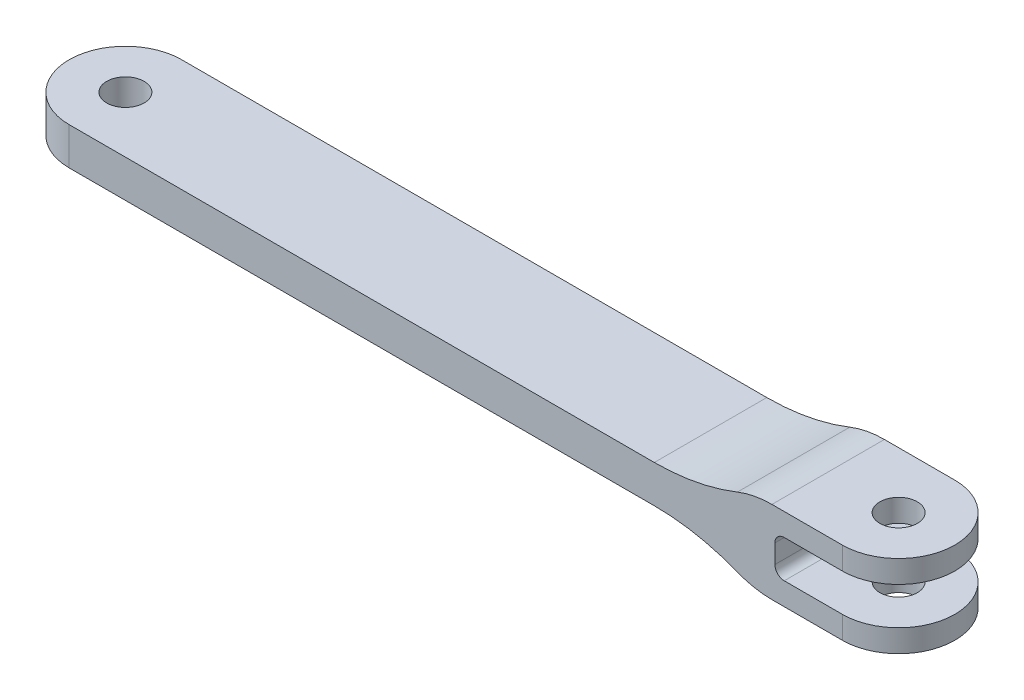
ISO-10303-21;
HEADER;
FILE_DESCRIPTION(('STEP AP214'),'2;1');
FILE_NAME('part.step','',(''),(''),'','','');
FILE_SCHEMA(('AUTOMOTIVE_DESIGN { 1 0 10303 214 1 1 1 1 }'));
ENDSEC;
DATA;
#1=APPLICATION_CONTEXT('core data for automotive mechanical design processes');
#2=APPLICATION_PROTOCOL_DEFINITION('international standard','automotive_design',2000,#1);
#3=PRODUCT_CONTEXT('',#1,'mechanical');
#4=PRODUCT('Part','Part','',(#3));
#5=PRODUCT_RELATED_PRODUCT_CATEGORY('part','',(#4));
#6=PRODUCT_DEFINITION_FORMATION('','',#4);
#7=PRODUCT_DEFINITION_CONTEXT('part definition',#1,'design');
#8=PRODUCT_DEFINITION('design','',#6,#7);
#9=PRODUCT_DEFINITION_SHAPE('','',#8);
#10=(LENGTH_UNIT() NAMED_UNIT(*) SI_UNIT(.MILLI.,.METRE.));
#11=(NAMED_UNIT(*) PLANE_ANGLE_UNIT() SI_UNIT($,.RADIAN.));
#12=(NAMED_UNIT(*) SI_UNIT($,.STERADIAN.) SOLID_ANGLE_UNIT());
#13=UNCERTAINTY_MEASURE_WITH_UNIT(LENGTH_MEASURE(1.E-05),#10,'distance_accuracy_value','');
#14=(GEOMETRIC_REPRESENTATION_CONTEXT(3) GLOBAL_UNCERTAINTY_ASSIGNED_CONTEXT((#13)) GLOBAL_UNIT_ASSIGNED_CONTEXT((#10,
#11,#12)) REPRESENTATION_CONTEXT('',''));
#15=CARTESIAN_POINT('',(0.,0.,0.));
#16=DIRECTION('',(0.,0.,1.));
#17=DIRECTION('',(1.,0.,0.));
#18=AXIS2_PLACEMENT_3D('',#15,#16,#17);
#19=CARTESIAN_POINT('',(42.0046244107277,4.5,0.));
#20=DIRECTION('',(0.,-1.,0.));
#21=DIRECTION('',(0.,0.,-1.));
#22=AXIS2_PLACEMENT_3D('',#19,#20,#21);
#23=CYLINDRICAL_SURFACE('',#22,6.);
#24=CARTESIAN_POINT('',(42.0046244107277,0.5,0.));
#25=DIRECTION('',(0.,1.,0.));
#26=DIRECTION('',(0.,0.,1.));
#27=AXIS2_PLACEMENT_3D('',#24,#25,#26);
#28=CIRCLE('',#27,6.);
#29=CARTESIAN_POINT('',(42.0046244107277,0.5,5.99999999999998));
#30=VERTEX_POINT('',#29);
#31=CARTESIAN_POINT('',(42.0046244107277,0.5,-6.00000000000002));
#32=VERTEX_POINT('',#31);
#33=EDGE_CURVE('E162',#30,#32,#28,.T.);
#34=ORIENTED_EDGE('',*,*,#33,.F.);
#35=DIRECTION('',(0.,-1.,0.));
#36=VECTOR('',#35,1.);
#37=CARTESIAN_POINT('',(42.0046244107277,4.5,5.99999999999998));
#38=LINE('',#37,#36);
#39=CARTESIAN_POINT('',(42.0046244107277,-1.9,5.99999999999998));
#40=VERTEX_POINT('',#39);
#41=EDGE_CURVE('E174',#30,#40,#38,.T.);
#42=ORIENTED_EDGE('',*,*,#41,.T.);
#43=CARTESIAN_POINT('',(42.0046244107277,-1.9,0.));
#44=DIRECTION('',(0.,1.,0.));
#45=DIRECTION('',(0.,0.,1.));
#46=AXIS2_PLACEMENT_3D('',#43,#44,#45);
#47=CIRCLE('',#46,6.);
#48=CARTESIAN_POINT('',(42.0046244107277,-1.9,-6.00000000000002));
#49=VERTEX_POINT('',#48);
#50=EDGE_CURVE('E254',#40,#49,#47,.T.);
#51=ORIENTED_EDGE('',*,*,#50,.T.);
#52=DIRECTION('',(0.,-1.,0.));
#53=VECTOR('',#52,1.);
#54=CARTESIAN_POINT('',(42.0046244107277,4.5,-6.00000000000002));
#55=LINE('',#54,#53);
#56=EDGE_CURVE('E176',#32,#49,#55,.T.);
#57=ORIENTED_EDGE('',*,*,#56,.F.);
#58=EDGE_LOOP('',(#34,#42,#51,#57));
#59=FACE_BOUND('',#58,.T.);
#60=ADVANCED_FACE('F44',(#59),#23,.T.);
#61=CARTESIAN_POINT('',(-40.4859221492723,4.5,0.));
#62=DIRECTION('',(0.,1.,0.));
#63=DIRECTION('',(0.,0.,1.));
#64=AXIS2_PLACEMENT_3D('',#61,#62,#63);
#65=PLANE('',#64);
#66=CARTESIAN_POINT('',(-40.4859221492723,4.5,0.));
#67=DIRECTION('',(0.,1.,0.));
#68=DIRECTION('',(0.,0.,1.));
#69=AXIS2_PLACEMENT_3D('',#66,#67,#68);
#70=CIRCLE('',#69,2.);
#71=CARTESIAN_POINT('',(-40.4859221492723,4.5,2.));
#72=VERTEX_POINT('',#71);
#73=EDGE_CURVE('E215',#72,#72,#70,.T.);
#74=ORIENTED_EDGE('',*,*,#73,.F.);
#75=EDGE_LOOP('',(#74));
#76=FACE_BOUND('',#75,.T.);
#77=DIRECTION('',(1.,0.,0.));
#78=VECTOR('',#77,1.);
#79=CARTESIAN_POINT('',(-40.4859221492723,4.5,6.));
#80=LINE('',#79,#78);
#81=CARTESIAN_POINT('',(-40.4859221492723,4.5,6.));
#82=VERTEX_POINT('',#81);
#83=CARTESIAN_POINT('',(21.9432669462301,4.5,5.99999999999999));
#84=VERTEX_POINT('',#83);
#85=EDGE_CURVE('E269',#82,#84,#80,.T.);
#86=ORIENTED_EDGE('',*,*,#85,.T.);
#87=DIRECTION('',(0.,0.,1.));
#88=VECTOR('',#87,1.);
#89=CARTESIAN_POINT('',(21.9432669462301,4.5,-6.00000000000001));
#90=LINE('',#89,#88);
#91=CARTESIAN_POINT('',(21.9432669462301,4.5,-6.00000000000001));
#92=VERTEX_POINT('',#91);
#93=EDGE_CURVE('E197',#84,#92,#90,.F.);
#94=ORIENTED_EDGE('',*,*,#93,.T.);
#95=DIRECTION('',(-1.,0.,0.));
#96=VECTOR('',#95,1.);
#97=CARTESIAN_POINT('',(-40.4859221492723,4.5,-6.));
#98=LINE('',#97,#96);
#99=CARTESIAN_POINT('',(-40.4859221492723,4.5,-6.));
#100=VERTEX_POINT('',#99);
#101=EDGE_CURVE('E273',#92,#100,#98,.T.);
#102=ORIENTED_EDGE('',*,*,#101,.T.);
#103=CARTESIAN_POINT('',(-40.4859221492723,4.5,0.));
#104=DIRECTION('',(0.,1.,0.));
#105=DIRECTION('',(0.,0.,1.));
#106=AXIS2_PLACEMENT_3D('',#103,#104,#105);
#107=CIRCLE('',#106,6.);
#108=EDGE_CURVE('E266',#100,#82,#107,.T.);
#109=ORIENTED_EDGE('',*,*,#108,.T.);
#110=EDGE_LOOP('',(#86,#94,#102,#109));
#111=FACE_BOUND('',#110,.T.);
#112=ADVANCED_FACE('F313',(#76,#111),#65,.T.);
#113=CARTESIAN_POINT('',(-40.4859221492723,0.5,0.));
#114=DIRECTION('',(0.,1.,0.));
#115=DIRECTION('',(0.,0.,1.));
#116=AXIS2_PLACEMENT_3D('',#113,#114,#115);
#117=PLANE('',#116);
#118=CARTESIAN_POINT('',(-40.4859221492723,0.5,0.));
#119=DIRECTION('',(0.,1.,0.));
#120=DIRECTION('',(0.,0.,1.));
#121=AXIS2_PLACEMENT_3D('',#118,#119,#120);
#122=CIRCLE('',#121,2.);
#123=CARTESIAN_POINT('',(-40.4859221492723,0.5,2.));
#124=VERTEX_POINT('',#123);
#125=EDGE_CURVE('E212',#124,#124,#122,.T.);
#126=ORIENTED_EDGE('',*,*,#125,.T.);
#127=EDGE_LOOP('',(#126));
#128=FACE_BOUND('',#127,.T.);
#129=DIRECTION('',(-1.,0.,0.));
#130=VECTOR('',#129,1.);
#131=CARTESIAN_POINT('',(-40.4859221492723,0.5,-6.));
#132=LINE('',#131,#130);
#133=CARTESIAN_POINT('',(21.9432669462301,0.5,-6.00000000000001));
#134=VERTEX_POINT('',#133);
#135=CARTESIAN_POINT('',(-40.4859221492723,0.5,-6.));
#136=VERTEX_POINT('',#135);
#137=EDGE_CURVE('E270',#134,#136,#132,.T.);
#138=ORIENTED_EDGE('',*,*,#137,.F.);
#139=DIRECTION('',(0.,0.,-1.));
#140=VECTOR('',#139,1.);
#141=CARTESIAN_POINT('',(21.9432669462301,0.5,0.));
#142=LINE('',#141,#140);
#143=CARTESIAN_POINT('',(21.9432669462301,0.5,5.99999999999999));
#144=VERTEX_POINT('',#143);
#145=EDGE_CURVE('E194',#134,#144,#142,.F.);
#146=ORIENTED_EDGE('',*,*,#145,.T.);
#147=DIRECTION('',(1.,0.,0.));
#148=VECTOR('',#147,1.);
#149=CARTESIAN_POINT('',(-40.4859221492723,0.5,6.));
#150=LINE('',#149,#148);
#151=CARTESIAN_POINT('',(-40.4859221492723,0.5,6.));
#152=VERTEX_POINT('',#151);
#153=EDGE_CURVE('E278',#152,#144,#150,.T.);
#154=ORIENTED_EDGE('',*,*,#153,.F.);
#155=CARTESIAN_POINT('',(-40.4859221492723,0.5,0.));
#156=DIRECTION('',(0.,1.,0.));
#157=DIRECTION('',(0.,0.,1.));
#158=AXIS2_PLACEMENT_3D('',#155,#156,#157);
#159=CIRCLE('',#158,6.);
#160=EDGE_CURVE('E265',#136,#152,#159,.T.);
#161=ORIENTED_EDGE('',*,*,#160,.F.);
#162=EDGE_LOOP('',(#138,#146,#154,#161));
#163=FACE_BOUND('',#162,.T.);
#164=ADVANCED_FACE('F301',(#128,#163),#117,.F.);
#165=CARTESIAN_POINT('',(-40.4859221492723,4.5,0.));
#166=DIRECTION('',(0.,-1.,0.));
#167=DIRECTION('',(0.,0.,-1.));
#168=AXIS2_PLACEMENT_3D('',#165,#166,#167);
#169=CYLINDRICAL_SURFACE('',#168,6.);
#170=ORIENTED_EDGE('',*,*,#160,.T.);
#171=DIRECTION('',(0.,-1.,0.));
#172=VECTOR('',#171,1.);
#173=CARTESIAN_POINT('',(-40.4859221492723,4.5,6.));
#174=LINE('',#173,#172);
#175=EDGE_CURVE('E187',#82,#152,#174,.T.);
#176=ORIENTED_EDGE('',*,*,#175,.F.);
#177=ORIENTED_EDGE('',*,*,#108,.F.);
#178=DIRECTION('',(0.,-1.,0.));
#179=VECTOR('',#178,1.);
#180=CARTESIAN_POINT('',(-40.4859221492723,4.5,-6.));
#181=LINE('',#180,#179);
#182=EDGE_CURVE('E275',#100,#136,#181,.T.);
#183=ORIENTED_EDGE('',*,*,#182,.T.);
#184=EDGE_LOOP('',(#170,#176,#177,#183));
#185=FACE_BOUND('',#184,.T.);
#186=ADVANCED_FACE('F303',(#185),#169,.T.);
#187=CARTESIAN_POINT('',(-40.4859221492723,4.5,6.));
#188=DIRECTION('',(0.,0.,-1.));
#189=DIRECTION('',(-1.,0.,0.));
#190=AXIS2_PLACEMENT_3D('',#187,#188,#189);
#191=PLANE('',#190);
#192=CARTESIAN_POINT('',(21.9432669462301,-23.5,5.99999999999999));
#193=DIRECTION('',(0.,0.,-1.));
#194=DIRECTION('',(-1.,0.,0.));
#195=AXIS2_PLACEMENT_3D('',#192,#193,#194);
#196=CIRCLE('',#195,24.);
#197=CARTESIAN_POINT('',(30.8003326260559,-1.19411764705882,5.99999999999999));
#198=VERTEX_POINT('',#197);
#199=EDGE_CURVE('E199',#144,#198,#196,.T.);
#200=ORIENTED_EDGE('',*,*,#199,.T.);
#201=CARTESIAN_POINT('',(34.4907766593166,8.1,5.99999999999998));
#202=DIRECTION('',(0.,0.,-1.));
#203=DIRECTION('',(-1.,0.,0.));
#204=AXIS2_PLACEMENT_3D('',#201,#202,#203);
#205=CIRCLE('',#204,10.);
#206=CARTESIAN_POINT('',(34.4907766593166,-1.9,6.));
#207=VERTEX_POINT('',#206);
#208=EDGE_CURVE('E237',#198,#207,#205,.F.);
#209=ORIENTED_EDGE('',*,*,#208,.T.);
#210=DIRECTION('',(1.,0.,0.));
#211=VECTOR('',#210,1.);
#212=CARTESIAN_POINT('',(42.0046244107277,-1.9,5.99999999999998));
#213=LINE('',#212,#211);
#214=EDGE_CURVE('E182',#207,#40,#213,.T.);
#215=ORIENTED_EDGE('',*,*,#214,.T.);
#216=ORIENTED_EDGE('',*,*,#41,.F.);
#217=DIRECTION('',(1.,0.,0.));
#218=VECTOR('',#217,1.);
#219=CARTESIAN_POINT('',(34.8046244107277,0.5,6.));
#220=LINE('',#219,#218);
#221=CARTESIAN_POINT('',(35.8046244107277,0.5,6.));
#222=VERTEX_POINT('',#221);
#223=EDGE_CURVE('E158',#222,#30,#220,.T.);
#224=ORIENTED_EDGE('',*,*,#223,.F.);
#225=CARTESIAN_POINT('',(35.8046244107277,1.5,5.99999999999998));
#226=DIRECTION('',(0.,0.,-1.));
#227=DIRECTION('',(-1.,0.,0.));
#228=AXIS2_PLACEMENT_3D('',#225,#226,#227);
#229=CIRCLE('',#228,1.);
#230=CARTESIAN_POINT('',(34.8046244107277,1.5,6.));
#231=VERTEX_POINT('',#230);
#232=EDGE_CURVE('E224',#222,#231,#229,.T.);
#233=ORIENTED_EDGE('',*,*,#232,.T.);
#234=DIRECTION('',(0.,-1.,0.));
#235=VECTOR('',#234,1.);
#236=CARTESIAN_POINT('',(34.8046244107277,4.5,6.));
#237=LINE('',#236,#235);
#238=CARTESIAN_POINT('',(34.8046244107277,3.5,6.));
#239=VERTEX_POINT('',#238);
#240=EDGE_CURVE('E336',#239,#231,#237,.T.);
#241=ORIENTED_EDGE('',*,*,#240,.F.);
#242=CARTESIAN_POINT('',(35.8046244107277,3.5,5.99999999999998));
#243=DIRECTION('',(0.,0.,-1.));
#244=DIRECTION('',(-1.,0.,0.));
#245=AXIS2_PLACEMENT_3D('',#242,#243,#244);
#246=CIRCLE('',#245,1.);
#247=CARTESIAN_POINT('',(35.8046244107277,4.5,6.));
#248=VERTEX_POINT('',#247);
#249=EDGE_CURVE('E228',#239,#248,#246,.T.);
#250=ORIENTED_EDGE('',*,*,#249,.T.);
#251=DIRECTION('',(1.,0.,0.));
#252=VECTOR('',#251,1.);
#253=CARTESIAN_POINT('',(34.8046244107277,4.5,6.));
#254=LINE('',#253,#252);
#255=CARTESIAN_POINT('',(42.0046244107277,4.5,5.99999999999998));
#256=VERTEX_POINT('',#255);
#257=EDGE_CURVE('E342',#248,#256,#254,.T.);
#258=ORIENTED_EDGE('',*,*,#257,.T.);
#259=CARTESIAN_POINT('',(42.0046244107277,6.9,5.99999999999998));
#260=VERTEX_POINT('',#259);
#261=EDGE_CURVE('E183',#260,#256,#38,.T.);
#262=ORIENTED_EDGE('',*,*,#261,.F.);
#263=DIRECTION('',(1.,0.,0.));
#264=VECTOR('',#263,1.);
#265=CARTESIAN_POINT('',(42.0046244107277,6.9,5.99999999999998));
#266=LINE('',#265,#264);
#267=CARTESIAN_POINT('',(34.4907766593166,6.9,6.));
#268=VERTEX_POINT('',#267);
#269=EDGE_CURVE('E249',#268,#260,#266,.T.);
#270=ORIENTED_EDGE('',*,*,#269,.F.);
#271=CARTESIAN_POINT('',(34.4907766593166,-3.1,5.99999999999998));
#272=DIRECTION('',(0.,0.,-1.));
#273=DIRECTION('',(-1.,0.,0.));
#274=AXIS2_PLACEMENT_3D('',#271,#272,#273);
#275=CIRCLE('',#274,10.);
#276=CARTESIAN_POINT('',(30.8003326260559,6.19411764705883,5.99999999999999));
#277=VERTEX_POINT('',#276);
#278=EDGE_CURVE('E235',#268,#277,#275,.F.);
#279=ORIENTED_EDGE('',*,*,#278,.T.);
#280=CARTESIAN_POINT('',(21.9432669462301,28.5,5.99999999999999));
#281=DIRECTION('',(0.,0.,-1.));
#282=DIRECTION('',(-1.,0.,0.));
#283=AXIS2_PLACEMENT_3D('',#280,#281,#282);
#284=CIRCLE('',#283,24.);
#285=EDGE_CURVE('E203',#277,#84,#284,.T.);
#286=ORIENTED_EDGE('',*,*,#285,.T.);
#287=ORIENTED_EDGE('',*,*,#85,.F.);
#288=ORIENTED_EDGE('',*,*,#175,.T.);
#289=ORIENTED_EDGE('',*,*,#153,.T.);
#290=EDGE_LOOP('',(#200,#209,#215,#216,#224,#233,#241,#250,#258,#262,#270,#279,#286,#287,#288,#289));
#291=FACE_BOUND('',#290,.T.);
#292=ADVANCED_FACE('F180',(#291),#191,.F.);
#293=ORIENTED_EDGE('',*,*,#261,.T.);
#294=CARTESIAN_POINT('',(42.0046244107277,4.5,0.));
#295=DIRECTION('',(0.,1.,0.));
#296=DIRECTION('',(0.,0.,1.));
#297=AXIS2_PLACEMENT_3D('',#294,#295,#296);
#298=CIRCLE('',#297,6.);
#299=CARTESIAN_POINT('',(42.0046244107277,4.5,-6.00000000000002));
#300=VERTEX_POINT('',#299);
#301=EDGE_CURVE('E333',#256,#300,#298,.T.);
#302=ORIENTED_EDGE('',*,*,#301,.T.);
#303=CARTESIAN_POINT('',(42.0046244107277,6.9,-6.00000000000002));
#304=VERTEX_POINT('',#303);
#305=EDGE_CURVE('E184',#304,#300,#55,.T.);
#306=ORIENTED_EDGE('',*,*,#305,.F.);
#307=CARTESIAN_POINT('',(42.0046244107277,6.9,0.));
#308=DIRECTION('',(0.,1.,0.));
#309=DIRECTION('',(0.,0.,1.));
#310=AXIS2_PLACEMENT_3D('',#307,#308,#309);
#311=CIRCLE('',#310,6.);
#312=EDGE_CURVE('E258',#260,#304,#311,.T.);
#313=ORIENTED_EDGE('',*,*,#312,.F.);
#314=EDGE_LOOP('',(#293,#302,#306,#313));
#315=FACE_BOUND('',#314,.T.);
#316=ADVANCED_FACE('F311',(#315),#23,.T.);
#317=CARTESIAN_POINT('',(-40.4859221492723,4.5,-6.));
#318=DIRECTION('',(0.,0.,1.));
#319=DIRECTION('',(1.,0.,0.));
#320=AXIS2_PLACEMENT_3D('',#317,#318,#319);
#321=PLANE('',#320);
#322=DIRECTION('',(-1.,0.,0.));
#323=VECTOR('',#322,1.);
#324=CARTESIAN_POINT('',(42.0046244107277,-1.9,-6.00000000000002));
#325=LINE('',#324,#323);
#326=CARTESIAN_POINT('',(34.4907766593166,-1.9,-6.00000000000002));
#327=VERTEX_POINT('',#326);
#328=EDGE_CURVE('E256',#49,#327,#325,.T.);
#329=ORIENTED_EDGE('',*,*,#328,.T.);
#330=CARTESIAN_POINT('',(34.4907766593166,8.1,-6.00000000000002));
#331=DIRECTION('',(0.,0.,1.));
#332=DIRECTION('',(1.,0.,0.));
#333=AXIS2_PLACEMENT_3D('',#330,#331,#332);
#334=CIRCLE('',#333,10.);
#335=CARTESIAN_POINT('',(30.8003326260559,-1.19411764705882,-6.00000000000001));
#336=VERTEX_POINT('',#335);
#337=EDGE_CURVE('E242',#327,#336,#334,.F.);
#338=ORIENTED_EDGE('',*,*,#337,.T.);
#339=CARTESIAN_POINT('',(21.9432669462301,-23.5,-6.00000000000001));
#340=DIRECTION('',(0.,0.,1.));
#341=DIRECTION('',(1.,0.,0.));
#342=AXIS2_PLACEMENT_3D('',#339,#340,#341);
#343=CIRCLE('',#342,24.);
#344=EDGE_CURVE('E201',#336,#134,#343,.T.);
#345=ORIENTED_EDGE('',*,*,#344,.T.);
#346=ORIENTED_EDGE('',*,*,#137,.T.);
#347=ORIENTED_EDGE('',*,*,#182,.F.);
#348=ORIENTED_EDGE('',*,*,#101,.F.);
#349=CARTESIAN_POINT('',(21.9432669462301,28.5,-6.00000000000001));
#350=DIRECTION('',(0.,0.,1.));
#351=DIRECTION('',(1.,0.,0.));
#352=AXIS2_PLACEMENT_3D('',#349,#350,#351);
#353=CIRCLE('',#352,24.);
#354=CARTESIAN_POINT('',(30.8003326260559,6.19411764705883,-6.00000000000001));
#355=VERTEX_POINT('',#354);
#356=EDGE_CURVE('E205',#92,#355,#353,.T.);
#357=ORIENTED_EDGE('',*,*,#356,.T.);
#358=CARTESIAN_POINT('',(34.4907766593166,-3.1,-6.00000000000002));
#359=DIRECTION('',(0.,0.,1.));
#360=DIRECTION('',(1.,0.,0.));
#361=AXIS2_PLACEMENT_3D('',#358,#359,#360);
#362=CIRCLE('',#361,10.);
#363=CARTESIAN_POINT('',(34.4907766593166,6.9,-6.00000000000002));
#364=VERTEX_POINT('',#363);
#365=EDGE_CURVE('E59',#355,#364,#362,.F.);
#366=ORIENTED_EDGE('',*,*,#365,.T.);
#367=DIRECTION('',(-1.,0.,0.));
#368=VECTOR('',#367,1.);
#369=CARTESIAN_POINT('',(42.0046244107277,6.9,-6.00000000000002));
#370=LINE('',#369,#368);
#371=EDGE_CURVE('E251',#304,#364,#370,.T.);
#372=ORIENTED_EDGE('',*,*,#371,.F.);
#373=ORIENTED_EDGE('',*,*,#305,.T.);
#374=DIRECTION('',(-1.,0.,0.));
#375=VECTOR('',#374,1.);
#376=CARTESIAN_POINT('',(42.0046244107277,4.5,-6.00000000000002));
#377=LINE('',#376,#375);
#378=CARTESIAN_POINT('',(35.8046244107277,4.5,-6.00000000000002));
#379=VERTEX_POINT('',#378);
#380=EDGE_CURVE('E177',#300,#379,#377,.T.);
#381=ORIENTED_EDGE('',*,*,#380,.T.);
#382=CARTESIAN_POINT('',(35.8046244107277,3.5,-6.00000000000002));
#383=DIRECTION('',(0.,0.,1.));
#384=DIRECTION('',(1.,0.,0.));
#385=AXIS2_PLACEMENT_3D('',#382,#383,#384);
#386=CIRCLE('',#385,1.);
#387=CARTESIAN_POINT('',(34.8046244107277,3.5,-6.00000000000002));
#388=VERTEX_POINT('',#387);
#389=EDGE_CURVE('E230',#379,#388,#386,.T.);
#390=ORIENTED_EDGE('',*,*,#389,.T.);
#391=DIRECTION('',(0.,-1.,0.));
#392=VECTOR('',#391,1.);
#393=CARTESIAN_POINT('',(34.8046244107277,4.5,-6.00000000000002));
#394=LINE('',#393,#392);
#395=CARTESIAN_POINT('',(34.8046244107277,1.5,-6.00000000000002));
#396=VERTEX_POINT('',#395);
#397=EDGE_CURVE('E334',#388,#396,#394,.T.);
#398=ORIENTED_EDGE('',*,*,#397,.T.);
#399=CARTESIAN_POINT('',(35.8046244107277,1.5,-6.00000000000002));
#400=DIRECTION('',(0.,0.,1.));
#401=DIRECTION('',(1.,0.,0.));
#402=AXIS2_PLACEMENT_3D('',#399,#400,#401);
#403=CIRCLE('',#402,1.);
#404=CARTESIAN_POINT('',(35.8046244107277,0.5,-6.00000000000002));
#405=VERTEX_POINT('',#404);
#406=EDGE_CURVE('E226',#396,#405,#403,.T.);
#407=ORIENTED_EDGE('',*,*,#406,.T.);
#408=DIRECTION('',(-1.,0.,0.));
#409=VECTOR('',#408,1.);
#410=CARTESIAN_POINT('',(42.0046244107277,0.5,-6.00000000000002));
#411=LINE('',#410,#409);
#412=EDGE_CURVE('E168',#32,#405,#411,.T.);
#413=ORIENTED_EDGE('',*,*,#412,.F.);
#414=ORIENTED_EDGE('',*,*,#56,.T.);
#415=EDGE_LOOP('',(#329,#338,#345,#346,#347,#348,#357,#366,#372,#373,#381,#390,#398,#407,#413,#414));
#416=FACE_BOUND('',#415,.T.);
#417=ADVANCED_FACE('F287',(#416),#321,.F.);
#418=CARTESIAN_POINT('',(42.0046244107277,-1.9,0.));
#419=DIRECTION('',(0.,1.,0.));
#420=DIRECTION('',(0.,0.,1.));
#421=AXIS2_PLACEMENT_3D('',#418,#419,#420);
#422=PLANE('',#421);
#423=CARTESIAN_POINT('',(42.0046244107277,-1.9,0.));
#424=DIRECTION('',(0.,1.,0.));
#425=DIRECTION('',(0.,0.,1.));
#426=AXIS2_PLACEMENT_3D('',#423,#424,#425);
#427=CIRCLE('',#426,2.);
#428=CARTESIAN_POINT('',(42.0046244107277,-1.9,1.99999999999999));
#429=VERTEX_POINT('',#428);
#430=EDGE_CURVE('E353',#429,#429,#427,.T.);
#431=ORIENTED_EDGE('',*,*,#430,.T.);
#432=EDGE_LOOP('',(#431));
#433=FACE_BOUND('',#432,.T.);
#434=ORIENTED_EDGE('',*,*,#214,.F.);
#435=DIRECTION('',(0.,0.,-1.));
#436=VECTOR('',#435,1.);
#437=CARTESIAN_POINT('',(34.4907766593166,-1.9,0.));
#438=LINE('',#437,#436);
#439=EDGE_CURVE('E239',#207,#327,#438,.T.);
#440=ORIENTED_EDGE('',*,*,#439,.T.);
#441=ORIENTED_EDGE('',*,*,#328,.F.);
#442=ORIENTED_EDGE('',*,*,#50,.F.);
#443=EDGE_LOOP('',(#434,#440,#441,#442));
#444=FACE_BOUND('',#443,.T.);
#445=ADVANCED_FACE('F290',(#433,#444),#422,.F.);
#446=CARTESIAN_POINT('',(42.0046244107277,6.9,0.));
#447=DIRECTION('',(0.,1.,0.));
#448=DIRECTION('',(0.,0.,1.));
#449=AXIS2_PLACEMENT_3D('',#446,#447,#448);
#450=PLANE('',#449);
#451=CARTESIAN_POINT('',(42.0046244107277,6.9,0.));
#452=DIRECTION('',(0.,1.,0.));
#453=DIRECTION('',(0.,0.,1.));
#454=AXIS2_PLACEMENT_3D('',#451,#452,#453);
#455=CIRCLE('',#454,2.);
#456=CARTESIAN_POINT('',(42.0046244107277,6.9,1.99999999999999));
#457=VERTEX_POINT('',#456);
#458=EDGE_CURVE('E211',#457,#457,#455,.T.);
#459=ORIENTED_EDGE('',*,*,#458,.F.);
#460=EDGE_LOOP('',(#459));
#461=FACE_BOUND('',#460,.T.);
#462=ORIENTED_EDGE('',*,*,#371,.T.);
#463=DIRECTION('',(0.,0.,1.));
#464=VECTOR('',#463,1.);
#465=CARTESIAN_POINT('',(34.4907766593166,6.9,6.));
#466=LINE('',#465,#464);
#467=EDGE_CURVE('E52',#364,#268,#466,.T.);
#468=ORIENTED_EDGE('',*,*,#467,.T.);
#469=ORIENTED_EDGE('',*,*,#269,.T.);
#470=ORIENTED_EDGE('',*,*,#312,.T.);
#471=EDGE_LOOP('',(#462,#468,#469,#470));
#472=FACE_BOUND('',#471,.T.);
#473=ADVANCED_FACE('F247',(#461,#472),#450,.T.);
#474=CARTESIAN_POINT('',(42.0046244107277,4.5,0.));
#475=DIRECTION('',(0.,1.,0.));
#476=DIRECTION('',(0.,0.,1.));
#477=AXIS2_PLACEMENT_3D('',#474,#475,#476);
#478=PLANE('',#477);
#479=CARTESIAN_POINT('',(42.0046244107277,4.5,0.));
#480=DIRECTION('',(0.,1.,0.));
#481=DIRECTION('',(0.,0.,1.));
#482=AXIS2_PLACEMENT_3D('',#479,#480,#481);
#483=CIRCLE('',#482,2.);
#484=CARTESIAN_POINT('',(42.0046244107277,4.5,1.99999999999999));
#485=VERTEX_POINT('',#484);
#486=EDGE_CURVE('E210',#485,#485,#483,.T.);
#487=ORIENTED_EDGE('',*,*,#486,.T.);
#488=EDGE_LOOP('',(#487));
#489=FACE_BOUND('',#488,.T.);
#490=ORIENTED_EDGE('',*,*,#257,.F.);
#491=DIRECTION('',(0.,0.,1.));
#492=VECTOR('',#491,1.);
#493=CARTESIAN_POINT('',(35.8046244107277,4.5,0.));
#494=LINE('',#493,#492);
#495=EDGE_CURVE('E222',#248,#379,#494,.F.);
#496=ORIENTED_EDGE('',*,*,#495,.T.);
#497=ORIENTED_EDGE('',*,*,#380,.F.);
#498=ORIENTED_EDGE('',*,*,#301,.F.);
#499=EDGE_LOOP('',(#490,#496,#497,#498));
#500=FACE_BOUND('',#499,.T.);
#501=ADVANCED_FACE('F378',(#489,#500),#478,.F.);
#502=CARTESIAN_POINT('',(34.8046244107277,4.5,-6.00000000000002));
#503=DIRECTION('',(1.,0.,0.));
#504=DIRECTION('',(0.,0.,-1.));
#505=AXIS2_PLACEMENT_3D('',#502,#503,#504);
#506=PLANE('',#505);
#507=ORIENTED_EDGE('',*,*,#240,.T.);
#508=DIRECTION('',(0.,0.,1.));
#509=VECTOR('',#508,1.);
#510=CARTESIAN_POINT('',(34.8046244107277,1.5,-6.00000000000002));
#511=LINE('',#510,#509);
#512=EDGE_CURVE('E220',#231,#396,#511,.F.);
#513=ORIENTED_EDGE('',*,*,#512,.T.);
#514=ORIENTED_EDGE('',*,*,#397,.F.);
#515=DIRECTION('',(0.,0.,1.));
#516=VECTOR('',#515,1.);
#517=CARTESIAN_POINT('',(34.8046244107277,3.5,-6.00000000000002));
#518=LINE('',#517,#516);
#519=EDGE_CURVE('E217',#388,#239,#518,.T.);
#520=ORIENTED_EDGE('',*,*,#519,.T.);
#521=EDGE_LOOP('',(#507,#513,#514,#520));
#522=FACE_BOUND('',#521,.T.);
#523=ADVANCED_FACE('F376',(#522),#506,.T.);
#524=CARTESIAN_POINT('',(42.0046244107277,0.5,0.));
#525=DIRECTION('',(0.,1.,0.));
#526=DIRECTION('',(0.,0.,1.));
#527=AXIS2_PLACEMENT_3D('',#524,#525,#526);
#528=PLANE('',#527);
#529=CARTESIAN_POINT('',(42.0046244107277,0.5,0.));
#530=DIRECTION('',(0.,1.,0.));
#531=DIRECTION('',(0.,0.,1.));
#532=AXIS2_PLACEMENT_3D('',#529,#530,#531);
#533=CIRCLE('',#532,2.);
#534=CARTESIAN_POINT('',(42.0046244107277,0.5,1.99999999999999));
#535=VERTEX_POINT('',#534);
#536=EDGE_CURVE('E207',#535,#535,#533,.T.);
#537=ORIENTED_EDGE('',*,*,#536,.F.);
#538=EDGE_LOOP('',(#537));
#539=FACE_BOUND('',#538,.T.);
#540=ORIENTED_EDGE('',*,*,#412,.T.);
#541=DIRECTION('',(0.,0.,1.));
#542=VECTOR('',#541,1.);
#543=CARTESIAN_POINT('',(35.8046244107277,0.5,6.));
#544=LINE('',#543,#542);
#545=EDGE_CURVE('E165',#405,#222,#544,.T.);
#546=ORIENTED_EDGE('',*,*,#545,.T.);
#547=ORIENTED_EDGE('',*,*,#223,.T.);
#548=ORIENTED_EDGE('',*,*,#33,.T.);
#549=EDGE_LOOP('',(#540,#546,#547,#548));
#550=FACE_BOUND('',#549,.T.);
#551=ADVANCED_FACE('F161',(#539,#550),#528,.T.);
#552=CARTESIAN_POINT('',(21.9432669462301,-23.5,-6.00000000000001));
#553=DIRECTION('',(0.,0.,-1.));
#554=DIRECTION('',(-1.,0.,0.));
#555=AXIS2_PLACEMENT_3D('',#552,#553,#554);
#556=CYLINDRICAL_SURFACE('',#555,24.);
#557=ORIENTED_EDGE('',*,*,#344,.F.);
#558=DIRECTION('',(0.,0.,-1.));
#559=VECTOR('',#558,1.);
#560=CARTESIAN_POINT('',(30.8003326260559,-1.19411764705882,-6.00000000000001));
#561=LINE('',#560,#559);
#562=EDGE_CURVE('E232',#336,#198,#561,.F.);
#563=ORIENTED_EDGE('',*,*,#562,.T.);
#564=ORIENTED_EDGE('',*,*,#199,.F.);
#565=ORIENTED_EDGE('',*,*,#145,.F.);
#566=EDGE_LOOP('',(#557,#563,#564,#565));
#567=FACE_BOUND('',#566,.T.);
#568=ADVANCED_FACE('F299',(#567),#556,.F.);
#569=CARTESIAN_POINT('',(21.9432669462301,28.5,-6.00000000000001));
#570=DIRECTION('',(0.,0.,-1.));
#571=DIRECTION('',(-1.,0.,0.));
#572=AXIS2_PLACEMENT_3D('',#569,#570,#571);
#573=CYLINDRICAL_SURFACE('',#572,24.);
#574=ORIENTED_EDGE('',*,*,#285,.F.);
#575=DIRECTION('',(0.,0.,-1.));
#576=VECTOR('',#575,1.);
#577=CARTESIAN_POINT('',(30.8003326260559,6.19411764705883,-6.00000000000001));
#578=LINE('',#577,#576);
#579=EDGE_CURVE('E11',#277,#355,#578,.T.);
#580=ORIENTED_EDGE('',*,*,#579,.T.);
#581=ORIENTED_EDGE('',*,*,#356,.F.);
#582=ORIENTED_EDGE('',*,*,#93,.F.);
#583=EDGE_LOOP('',(#574,#580,#581,#582));
#584=FACE_BOUND('',#583,.T.);
#585=ADVANCED_FACE('F361',(#584),#573,.F.);
#586=CARTESIAN_POINT('',(42.0046244107277,-1.9,0.));
#587=DIRECTION('',(0.,1.,0.));
#588=DIRECTION('',(0.,0.,1.));
#589=AXIS2_PLACEMENT_3D('',#586,#587,#588);
#590=CYLINDRICAL_SURFACE('',#589,2.);
#591=ORIENTED_EDGE('',*,*,#536,.T.);
#592=EDGE_LOOP('',(#591));
#593=FACE_BOUND('',#592,.T.);
#594=ORIENTED_EDGE('',*,*,#430,.F.);
#595=EDGE_LOOP('',(#594));
#596=FACE_BOUND('',#595,.T.);
#597=ADVANCED_FACE('F358',(#593,#596),#590,.F.);
#598=ORIENTED_EDGE('',*,*,#458,.T.);
#599=EDGE_LOOP('',(#598));
#600=FACE_BOUND('',#599,.T.);
#601=ORIENTED_EDGE('',*,*,#486,.F.);
#602=EDGE_LOOP('',(#601));
#603=FACE_BOUND('',#602,.T.);
#604=ADVANCED_FACE('F360',(#600,#603),#590,.F.);
#605=CARTESIAN_POINT('',(-40.4859221492723,-1.9,0.));
#606=DIRECTION('',(0.,1.,0.));
#607=DIRECTION('',(0.,0.,1.));
#608=AXIS2_PLACEMENT_3D('',#605,#606,#607);
#609=CYLINDRICAL_SURFACE('',#608,2.);
#610=ORIENTED_EDGE('',*,*,#73,.T.);
#611=EDGE_LOOP('',(#610));
#612=FACE_BOUND('',#611,.T.);
#613=ORIENTED_EDGE('',*,*,#125,.F.);
#614=EDGE_LOOP('',(#613));
#615=FACE_BOUND('',#614,.T.);
#616=ADVANCED_FACE('F368',(#612,#615),#609,.F.);
#617=CARTESIAN_POINT('',(35.8046244107277,1.5,0.));
#618=DIRECTION('',(0.,0.,-1.));
#619=DIRECTION('',(-1.,0.,0.));
#620=AXIS2_PLACEMENT_3D('',#617,#618,#619);
#621=CYLINDRICAL_SURFACE('',#620,1.);
#622=ORIENTED_EDGE('',*,*,#406,.F.);
#623=ORIENTED_EDGE('',*,*,#512,.F.);
#624=ORIENTED_EDGE('',*,*,#232,.F.);
#625=ORIENTED_EDGE('',*,*,#545,.F.);
#626=EDGE_LOOP('',(#622,#623,#624,#625));
#627=FACE_BOUND('',#626,.T.);
#628=ADVANCED_FACE('F432',(#627),#621,.F.);
#629=CARTESIAN_POINT('',(35.8046244107277,3.5,-6.00000000000002));
#630=DIRECTION('',(0.,0.,1.));
#631=DIRECTION('',(1.,0.,0.));
#632=AXIS2_PLACEMENT_3D('',#629,#630,#631);
#633=CYLINDRICAL_SURFACE('',#632,1.);
#634=ORIENTED_EDGE('',*,*,#389,.F.);
#635=ORIENTED_EDGE('',*,*,#495,.F.);
#636=ORIENTED_EDGE('',*,*,#249,.F.);
#637=ORIENTED_EDGE('',*,*,#519,.F.);
#638=EDGE_LOOP('',(#634,#635,#636,#637));
#639=FACE_BOUND('',#638,.T.);
#640=ADVANCED_FACE('F413',(#639),#633,.F.);
#641=CARTESIAN_POINT('',(34.4907766593166,8.1,-6.00000000000002));
#642=DIRECTION('',(0.,0.,-1.));
#643=DIRECTION('',(-1.,0.,0.));
#644=AXIS2_PLACEMENT_3D('',#641,#642,#643);
#645=CYLINDRICAL_SURFACE('',#644,10.);
#646=ORIENTED_EDGE('',*,*,#337,.F.);
#647=ORIENTED_EDGE('',*,*,#439,.F.);
#648=ORIENTED_EDGE('',*,*,#208,.F.);
#649=ORIENTED_EDGE('',*,*,#562,.F.);
#650=EDGE_LOOP('',(#646,#647,#648,#649));
#651=FACE_BOUND('',#650,.T.);
#652=ADVANCED_FACE('F293',(#651),#645,.T.);
#653=CARTESIAN_POINT('',(34.4907766593166,-3.1,-6.00000000000002));
#654=DIRECTION('',(0.,0.,-1.));
#655=DIRECTION('',(-1.,0.,0.));
#656=AXIS2_PLACEMENT_3D('',#653,#654,#655);
#657=CYLINDRICAL_SURFACE('',#656,10.);
#658=ORIENTED_EDGE('',*,*,#365,.F.);
#659=ORIENTED_EDGE('',*,*,#579,.F.);
#660=ORIENTED_EDGE('',*,*,#278,.F.);
#661=ORIENTED_EDGE('',*,*,#467,.F.);
#662=EDGE_LOOP('',(#658,#659,#660,#661));
#663=FACE_BOUND('',#662,.T.);
#664=ADVANCED_FACE('F46',(#663),#657,.T.);
#665=CLOSED_SHELL('',(#60,#112,#164,#186,#292,#316,#417,#445,#473,#501,#523,#551,#568,#585,#597,
#604,#616,#628,#640,#652,#664));
#666=MANIFOLD_SOLID_BREP('B2',#665);
#667=ADVANCED_BREP_SHAPE_REPRESENTATION('',(#18,#666),#14);
#668=SHAPE_DEFINITION_REPRESENTATION(#9,#667);
ENDSEC;
END-ISO-10303-21;
